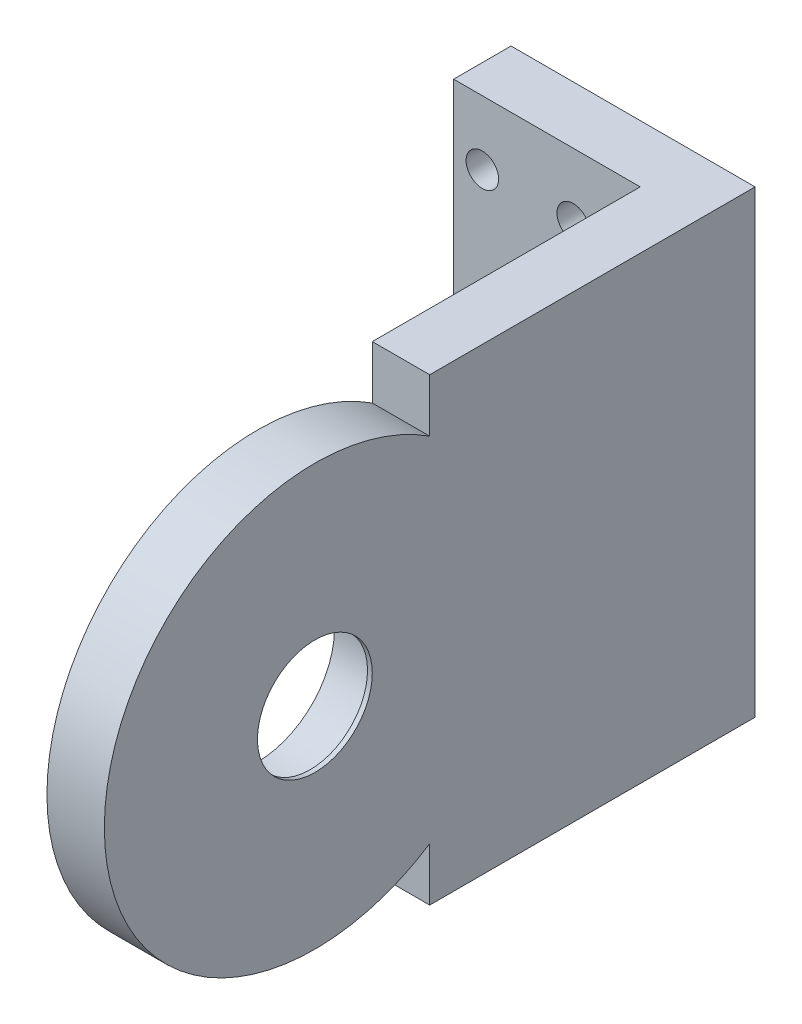
ISO-10303-21;
HEADER;
FILE_DESCRIPTION(('STEP AP214'),'2;1');
FILE_NAME('part.step','',(''),(''),'','','');
FILE_SCHEMA(('AUTOMOTIVE_DESIGN { 1 0 10303 214 1 1 1 1 }'));
ENDSEC;
DATA;
#1=APPLICATION_CONTEXT('core data for automotive mechanical design processes');
#2=APPLICATION_PROTOCOL_DEFINITION('international standard','automotive_design',2000,#1);
#3=PRODUCT_CONTEXT('',#1,'mechanical');
#4=PRODUCT('Part','Part','',(#3));
#5=PRODUCT_RELATED_PRODUCT_CATEGORY('part','',(#4));
#6=PRODUCT_DEFINITION_FORMATION('','',#4);
#7=PRODUCT_DEFINITION_CONTEXT('part definition',#1,'design');
#8=PRODUCT_DEFINITION('design','',#6,#7);
#9=PRODUCT_DEFINITION_SHAPE('','',#8);
#10=(LENGTH_UNIT() NAMED_UNIT(*) SI_UNIT(.MILLI.,.METRE.));
#11=(NAMED_UNIT(*) PLANE_ANGLE_UNIT() SI_UNIT($,.RADIAN.));
#12=(NAMED_UNIT(*) SI_UNIT($,.STERADIAN.) SOLID_ANGLE_UNIT());
#13=UNCERTAINTY_MEASURE_WITH_UNIT(LENGTH_MEASURE(1.E-05),#10,'distance_accuracy_value','');
#14=(GEOMETRIC_REPRESENTATION_CONTEXT(3) GLOBAL_UNCERTAINTY_ASSIGNED_CONTEXT((#13)) GLOBAL_UNIT_ASSIGNED_CONTEXT((#10,
#11,#12)) REPRESENTATION_CONTEXT('',''));
#15=CARTESIAN_POINT('',(0.,0.,0.));
#16=DIRECTION('',(0.,0.,1.));
#17=DIRECTION('',(1.,0.,0.));
#18=AXIS2_PLACEMENT_3D('',#15,#16,#17);
#19=CARTESIAN_POINT('',(342.5,300.,300.));
#20=DIRECTION('',(-1.,0.,0.));
#21=DIRECTION('',(0.,0.,1.));
#22=AXIS2_PLACEMENT_3D('',#19,#20,#21);
#23=CYLINDRICAL_SURFACE('',#22,22.);
#24=DIRECTION('',(-1.,0.,0.));
#25=VECTOR('',#24,1.);
#26=CARTESIAN_POINT('',(342.5,281.560911085414,288.));
#27=LINE('',#26,#25);
#28=CARTESIAN_POINT('',(342.5,281.560911085414,288.));
#29=VERTEX_POINT('',#28);
#30=CARTESIAN_POINT('',(336.5,281.560911085414,288.));
#31=VERTEX_POINT('',#30);
#32=EDGE_CURVE('E63',#29,#31,#27,.T.);
#33=ORIENTED_EDGE('',*,*,#32,.F.);
#34=CARTESIAN_POINT('',(342.5,300.,300.));
#35=DIRECTION('',(1.,0.,0.));
#36=DIRECTION('',(0.,0.,-1.));
#37=AXIS2_PLACEMENT_3D('',#34,#35,#36);
#38=CIRCLE('',#37,22.);
#39=CARTESIAN_POINT('',(342.5,318.439088914586,288.));
#40=VERTEX_POINT('',#39);
#41=EDGE_CURVE('E11',#40,#29,#38,.T.);
#42=ORIENTED_EDGE('',*,*,#41,.F.);
#43=DIRECTION('',(-1.,0.,0.));
#44=VECTOR('',#43,1.);
#45=CARTESIAN_POINT('',(342.5,318.439088914586,288.));
#46=LINE('',#45,#44);
#47=CARTESIAN_POINT('',(336.5,318.439088914586,288.));
#48=VERTEX_POINT('',#47);
#49=EDGE_CURVE('E169',#48,#40,#46,.F.);
#50=ORIENTED_EDGE('',*,*,#49,.F.);
#51=CARTESIAN_POINT('',(336.5,300.,300.));
#52=DIRECTION('',(1.,0.,0.));
#53=DIRECTION('',(0.,0.,-1.));
#54=AXIS2_PLACEMENT_3D('',#51,#52,#53);
#55=CIRCLE('',#54,22.);
#56=EDGE_CURVE('E47',#48,#31,#55,.T.);
#57=ORIENTED_EDGE('',*,*,#56,.T.);
#58=EDGE_LOOP('',(#33,#42,#50,#57));
#59=FACE_BOUND('',#58,.T.);
#60=ADVANCED_FACE('F39',(#59),#23,.T.);
#61=CARTESIAN_POINT('',(342.5,300.,300.));
#62=DIRECTION('',(1.,0.,0.));
#63=DIRECTION('',(0.,0.,-1.));
#64=AXIS2_PLACEMENT_3D('',#61,#62,#63);
#65=PLANE('',#64);
#66=CARTESIAN_POINT('',(342.5,300.,300.));
#67=DIRECTION('',(1.,0.,0.));
#68=DIRECTION('',(0.,0.,-1.));
#69=AXIS2_PLACEMENT_3D('',#66,#67,#68);
#70=CIRCLE('',#69,6.00000000000001);
#71=CARTESIAN_POINT('',(342.5,300.,294.));
#72=VERTEX_POINT('',#71);
#73=EDGE_CURVE('E139',#72,#72,#70,.F.);
#74=ORIENTED_EDGE('',*,*,#73,.T.);
#75=EDGE_LOOP('',(#74));
#76=FACE_BOUND('',#75,.T.);
#77=ORIENTED_EDGE('',*,*,#41,.T.);
#78=DIRECTION('',(0.,-1.,0.));
#79=VECTOR('',#78,1.);
#80=CARTESIAN_POINT('',(342.5,276.,288.));
#81=LINE('',#80,#79);
#82=CARTESIAN_POINT('',(342.5,276.,288.));
#83=VERTEX_POINT('',#82);
#84=EDGE_CURVE('E148',#29,#83,#81,.T.);
#85=ORIENTED_EDGE('',*,*,#84,.T.);
#86=DIRECTION('',(0.,0.,-1.));
#87=VECTOR('',#86,1.);
#88=CARTESIAN_POINT('',(342.5,276.,254.));
#89=LINE('',#88,#87);
#90=CARTESIAN_POINT('',(342.5,276.,254.));
#91=VERTEX_POINT('',#90);
#92=EDGE_CURVE('E152',#83,#91,#89,.T.);
#93=ORIENTED_EDGE('',*,*,#92,.T.);
#94=DIRECTION('',(0.,1.,0.));
#95=VECTOR('',#94,1.);
#96=CARTESIAN_POINT('',(342.5,324.,254.));
#97=LINE('',#96,#95);
#98=CARTESIAN_POINT('',(342.5,324.,254.));
#99=VERTEX_POINT('',#98);
#100=EDGE_CURVE('E143',#91,#99,#97,.T.);
#101=ORIENTED_EDGE('',*,*,#100,.T.);
#102=DIRECTION('',(0.,0.,1.));
#103=VECTOR('',#102,1.);
#104=CARTESIAN_POINT('',(342.5,324.,288.));
#105=LINE('',#104,#103);
#106=CARTESIAN_POINT('',(342.5,324.,288.));
#107=VERTEX_POINT('',#106);
#108=EDGE_CURVE('E146',#99,#107,#105,.T.);
#109=ORIENTED_EDGE('',*,*,#108,.T.);
#110=EDGE_CURVE('E149',#107,#40,#81,.T.);
#111=ORIENTED_EDGE('',*,*,#110,.T.);
#112=EDGE_LOOP('',(#77,#85,#93,#101,#109,#111));
#113=FACE_BOUND('',#112,.T.);
#114=ADVANCED_FACE('F188',(#76,#113),#65,.T.);
#115=CARTESIAN_POINT('',(336.5,300.,300.));
#116=DIRECTION('',(1.,0.,0.));
#117=DIRECTION('',(0.,0.,-1.));
#118=AXIS2_PLACEMENT_3D('',#115,#116,#117);
#119=PLANE('',#118);
#120=CARTESIAN_POINT('',(336.5,300.,300.));
#121=DIRECTION('',(1.,0.,0.));
#122=DIRECTION('',(0.,0.,-1.));
#123=AXIS2_PLACEMENT_3D('',#120,#121,#122);
#124=CIRCLE('',#123,8.05);
#125=CARTESIAN_POINT('',(336.5,300.,291.95));
#126=VERTEX_POINT('',#125);
#127=EDGE_CURVE('E129',#126,#126,#124,.T.);
#128=ORIENTED_EDGE('',*,*,#127,.T.);
#129=EDGE_LOOP('',(#128));
#130=FACE_BOUND('',#129,.T.);
#131=DIRECTION('',(0.,0.,1.));
#132=VECTOR('',#131,1.);
#133=CARTESIAN_POINT('',(336.5,324.,288.));
#134=LINE('',#133,#132);
#135=CARTESIAN_POINT('',(336.5,324.,260.));
#136=VERTEX_POINT('',#135);
#137=CARTESIAN_POINT('',(336.5,324.,288.));
#138=VERTEX_POINT('',#137);
#139=EDGE_CURVE('E142',#136,#138,#134,.T.);
#140=ORIENTED_EDGE('',*,*,#139,.F.);
#141=DIRECTION('',(0.,-1.,0.));
#142=VECTOR('',#141,1.);
#143=CARTESIAN_POINT('',(336.5,300.,260.));
#144=LINE('',#143,#142);
#145=CARTESIAN_POINT('',(336.5,276.,260.));
#146=VERTEX_POINT('',#145);
#147=EDGE_CURVE('E126',#136,#146,#144,.T.);
#148=ORIENTED_EDGE('',*,*,#147,.T.);
#149=DIRECTION('',(0.,0.,-1.));
#150=VECTOR('',#149,1.);
#151=CARTESIAN_POINT('',(336.5,276.,254.));
#152=LINE('',#151,#150);
#153=CARTESIAN_POINT('',(336.5,276.,288.));
#154=VERTEX_POINT('',#153);
#155=EDGE_CURVE('E113',#154,#146,#152,.T.);
#156=ORIENTED_EDGE('',*,*,#155,.F.);
#157=DIRECTION('',(0.,-1.,0.));
#158=VECTOR('',#157,1.);
#159=CARTESIAN_POINT('',(336.5,276.,288.));
#160=LINE('',#159,#158);
#161=EDGE_CURVE('E156',#31,#154,#160,.T.);
#162=ORIENTED_EDGE('',*,*,#161,.F.);
#163=ORIENTED_EDGE('',*,*,#56,.F.);
#164=EDGE_CURVE('E157',#138,#48,#160,.T.);
#165=ORIENTED_EDGE('',*,*,#164,.F.);
#166=EDGE_LOOP('',(#140,#148,#156,#162,#163,#165));
#167=FACE_BOUND('',#166,.T.);
#168=ADVANCED_FACE('F181',(#130,#167),#119,.F.);
#169=CARTESIAN_POINT('',(342.5,276.,288.));
#170=DIRECTION('',(0.,0.,-1.));
#171=DIRECTION('',(-1.,0.,0.));
#172=AXIS2_PLACEMENT_3D('',#169,#170,#171);
#173=PLANE('',#172);
#174=ORIENTED_EDGE('',*,*,#84,.F.);
#175=ORIENTED_EDGE('',*,*,#32,.T.);
#176=ORIENTED_EDGE('',*,*,#161,.T.);
#177=DIRECTION('',(-1.,0.,0.));
#178=VECTOR('',#177,1.);
#179=CARTESIAN_POINT('',(342.5,276.,288.));
#180=LINE('',#179,#178);
#181=EDGE_CURVE('E162',#83,#154,#180,.T.);
#182=ORIENTED_EDGE('',*,*,#181,.F.);
#183=EDGE_LOOP('',(#174,#175,#176,#182));
#184=FACE_BOUND('',#183,.T.);
#185=ADVANCED_FACE('F178',(#184),#173,.F.);
#186=ORIENTED_EDGE('',*,*,#164,.T.);
#187=ORIENTED_EDGE('',*,*,#49,.T.);
#188=ORIENTED_EDGE('',*,*,#110,.F.);
#189=DIRECTION('',(-1.,0.,0.));
#190=VECTOR('',#189,1.);
#191=CARTESIAN_POINT('',(342.5,324.,288.));
#192=LINE('',#191,#190);
#193=EDGE_CURVE('E164',#107,#138,#192,.T.);
#194=ORIENTED_EDGE('',*,*,#193,.T.);
#195=EDGE_LOOP('',(#186,#187,#188,#194));
#196=FACE_BOUND('',#195,.T.);
#197=ADVANCED_FACE('F186',(#196),#173,.F.);
#198=CARTESIAN_POINT('',(342.5,324.,254.));
#199=DIRECTION('',(0.,0.,1.));
#200=DIRECTION('',(1.,0.,0.));
#201=AXIS2_PLACEMENT_3D('',#198,#199,#200);
#202=PLANE('',#201);
#203=DIRECTION('',(0.,-1.,0.));
#204=VECTOR('',#203,1.);
#205=CARTESIAN_POINT('',(317.,324.,254.));
#206=LINE('',#205,#204);
#207=CARTESIAN_POINT('',(317.,324.,254.));
#208=VERTEX_POINT('',#207);
#209=CARTESIAN_POINT('',(317.,276.,254.));
#210=VERTEX_POINT('',#209);
#211=EDGE_CURVE('E122',#208,#210,#206,.T.);
#212=ORIENTED_EDGE('',*,*,#211,.F.);
#213=DIRECTION('',(-1.,0.,0.));
#214=VECTOR('',#213,1.);
#215=CARTESIAN_POINT('',(342.5,324.,254.));
#216=LINE('',#215,#214);
#217=EDGE_CURVE('E167',#99,#208,#216,.T.);
#218=ORIENTED_EDGE('',*,*,#217,.F.);
#219=ORIENTED_EDGE('',*,*,#100,.F.);
#220=DIRECTION('',(-1.,0.,0.));
#221=VECTOR('',#220,1.);
#222=CARTESIAN_POINT('',(342.5,276.,254.));
#223=LINE('',#222,#221);
#224=EDGE_CURVE('E154',#91,#210,#223,.T.);
#225=ORIENTED_EDGE('',*,*,#224,.T.);
#226=EDGE_LOOP('',(#212,#218,#219,#225));
#227=FACE_BOUND('',#226,.T.);
#228=CARTESIAN_POINT('',(320.,282.7,254.));
#229=DIRECTION('',(0.,0.,1.));
#230=DIRECTION('',(1.,0.,0.));
#231=AXIS2_PLACEMENT_3D('',#228,#229,#230);
#232=CIRCLE('',#231,1.69999999999998);
#233=CARTESIAN_POINT('',(321.7,282.7,254.));
#234=VERTEX_POINT('',#233);
#235=EDGE_CURVE('E196',#234,#234,#232,.T.);
#236=ORIENTED_EDGE('',*,*,#235,.T.);
#237=EDGE_LOOP('',(#236));
#238=FACE_BOUND('',#237,.T.);
#239=CARTESIAN_POINT('',(320.,317.3,254.));
#240=DIRECTION('',(0.,0.,1.));
#241=DIRECTION('',(1.,0.,0.));
#242=AXIS2_PLACEMENT_3D('',#239,#240,#241);
#243=CIRCLE('',#242,1.69999999999998);
#244=CARTESIAN_POINT('',(321.7,317.3,254.));
#245=VERTEX_POINT('',#244);
#246=EDGE_CURVE('E203',#245,#245,#243,.T.);
#247=ORIENTED_EDGE('',*,*,#246,.T.);
#248=EDGE_LOOP('',(#247));
#249=FACE_BOUND('',#248,.T.);
#250=CARTESIAN_POINT('',(329.5,282.7,254.));
#251=DIRECTION('',(0.,0.,1.));
#252=DIRECTION('',(1.,0.,0.));
#253=AXIS2_PLACEMENT_3D('',#250,#251,#252);
#254=CIRCLE('',#253,1.69999999999998);
#255=CARTESIAN_POINT('',(331.2,282.7,254.));
#256=VERTEX_POINT('',#255);
#257=EDGE_CURVE('E209',#256,#256,#254,.T.);
#258=ORIENTED_EDGE('',*,*,#257,.T.);
#259=EDGE_LOOP('',(#258));
#260=FACE_BOUND('',#259,.T.);
#261=CARTESIAN_POINT('',(329.5,317.3,254.));
#262=DIRECTION('',(0.,0.,1.));
#263=DIRECTION('',(1.,0.,0.));
#264=AXIS2_PLACEMENT_3D('',#261,#262,#263);
#265=CIRCLE('',#264,1.69999999999998);
#266=CARTESIAN_POINT('',(331.2,317.3,254.));
#267=VERTEX_POINT('',#266);
#268=EDGE_CURVE('E215',#267,#267,#265,.T.);
#269=ORIENTED_EDGE('',*,*,#268,.T.);
#270=EDGE_LOOP('',(#269));
#271=FACE_BOUND('',#270,.T.);
#272=ADVANCED_FACE('F192',(#227,#238,#249,#260,#271),#202,.F.);
#273=CARTESIAN_POINT('',(342.5,324.,288.));
#274=DIRECTION('',(0.,-1.,0.));
#275=DIRECTION('',(0.,0.,-1.));
#276=AXIS2_PLACEMENT_3D('',#273,#274,#275);
#277=PLANE('',#276);
#278=ORIENTED_EDGE('',*,*,#217,.T.);
#279=DIRECTION('',(0.,0.,-1.));
#280=VECTOR('',#279,1.);
#281=CARTESIAN_POINT('',(317.,324.,260.));
#282=LINE('',#281,#280);
#283=CARTESIAN_POINT('',(317.,324.,260.));
#284=VERTEX_POINT('',#283);
#285=EDGE_CURVE('E127',#284,#208,#282,.T.);
#286=ORIENTED_EDGE('',*,*,#285,.F.);
#287=DIRECTION('',(-1.,0.,0.));
#288=VECTOR('',#287,1.);
#289=CARTESIAN_POINT('',(336.51,324.,260.));
#290=LINE('',#289,#288);
#291=EDGE_CURVE('E55',#136,#284,#290,.T.);
#292=ORIENTED_EDGE('',*,*,#291,.F.);
#293=ORIENTED_EDGE('',*,*,#139,.T.);
#294=ORIENTED_EDGE('',*,*,#193,.F.);
#295=ORIENTED_EDGE('',*,*,#108,.F.);
#296=EDGE_LOOP('',(#278,#286,#292,#293,#294,#295));
#297=FACE_BOUND('',#296,.T.);
#298=ADVANCED_FACE('F183',(#297),#277,.F.);
#299=CARTESIAN_POINT('',(342.5,276.,254.));
#300=DIRECTION('',(0.,1.,0.));
#301=DIRECTION('',(0.,0.,1.));
#302=AXIS2_PLACEMENT_3D('',#299,#300,#301);
#303=PLANE('',#302);
#304=ORIENTED_EDGE('',*,*,#155,.T.);
#305=DIRECTION('',(1.,0.,0.));
#306=VECTOR('',#305,1.);
#307=CARTESIAN_POINT('',(317.,276.,260.));
#308=LINE('',#307,#306);
#309=CARTESIAN_POINT('',(317.,276.,260.));
#310=VERTEX_POINT('',#309);
#311=EDGE_CURVE('E104',#310,#146,#308,.T.);
#312=ORIENTED_EDGE('',*,*,#311,.F.);
#313=DIRECTION('',(0.,0.,-1.));
#314=VECTOR('',#313,1.);
#315=CARTESIAN_POINT('',(317.,276.,260.));
#316=LINE('',#315,#314);
#317=EDGE_CURVE('E109',#310,#210,#316,.T.);
#318=ORIENTED_EDGE('',*,*,#317,.T.);
#319=ORIENTED_EDGE('',*,*,#224,.F.);
#320=ORIENTED_EDGE('',*,*,#92,.F.);
#321=ORIENTED_EDGE('',*,*,#181,.T.);
#322=EDGE_LOOP('',(#304,#312,#318,#319,#320,#321));
#323=FACE_BOUND('',#322,.T.);
#324=ADVANCED_FACE('F106',(#323),#303,.F.);
#325=CARTESIAN_POINT('',(342.51,300.,300.));
#326=DIRECTION('',(-1.,0.,0.));
#327=DIRECTION('',(0.,0.,1.));
#328=AXIS2_PLACEMENT_3D('',#325,#326,#327);
#329=CYLINDRICAL_SURFACE('',#328,6.00000000000001);
#330=CARTESIAN_POINT('',(342.,300.,300.));
#331=DIRECTION('',(1.,0.,0.));
#332=DIRECTION('',(0.,0.,-1.));
#333=AXIS2_PLACEMENT_3D('',#330,#331,#332);
#334=CIRCLE('',#333,6.00000000000001);
#335=CARTESIAN_POINT('',(342.,300.,294.));
#336=VERTEX_POINT('',#335);
#337=EDGE_CURVE('E42',#336,#336,#334,.T.);
#338=ORIENTED_EDGE('',*,*,#337,.F.);
#339=EDGE_LOOP('',(#338));
#340=FACE_BOUND('',#339,.T.);
#341=ORIENTED_EDGE('',*,*,#73,.F.);
#342=EDGE_LOOP('',(#341));
#343=FACE_BOUND('',#342,.T.);
#344=ADVANCED_FACE('F268',(#340,#343),#329,.F.);
#345=CARTESIAN_POINT('',(342.,300.,300.));
#346=DIRECTION('',(-1.,0.,0.));
#347=DIRECTION('',(0.,0.,1.));
#348=AXIS2_PLACEMENT_3D('',#345,#346,#347);
#349=CYLINDRICAL_SURFACE('',#348,8.05);
#350=CARTESIAN_POINT('',(342.,300.,300.));
#351=DIRECTION('',(1.,0.,0.));
#352=DIRECTION('',(0.,0.,-1.));
#353=AXIS2_PLACEMENT_3D('',#350,#351,#352);
#354=CIRCLE('',#353,8.05);
#355=CARTESIAN_POINT('',(342.,300.,291.95));
#356=VERTEX_POINT('',#355);
#357=EDGE_CURVE('E134',#356,#356,#354,.T.);
#358=ORIENTED_EDGE('',*,*,#357,.T.);
#359=EDGE_LOOP('',(#358));
#360=FACE_BOUND('',#359,.T.);
#361=ORIENTED_EDGE('',*,*,#127,.F.);
#362=EDGE_LOOP('',(#361));
#363=FACE_BOUND('',#362,.T.);
#364=ADVANCED_FACE('F270',(#360,#363),#349,.F.);
#365=CARTESIAN_POINT('',(342.,300.,300.));
#366=DIRECTION('',(1.,0.,0.));
#367=DIRECTION('',(0.,0.,-1.));
#368=AXIS2_PLACEMENT_3D('',#365,#366,#367);
#369=PLANE('',#368);
#370=ORIENTED_EDGE('',*,*,#337,.T.);
#371=EDGE_LOOP('',(#370));
#372=FACE_BOUND('',#371,.T.);
#373=ORIENTED_EDGE('',*,*,#357,.F.);
#374=EDGE_LOOP('',(#373));
#375=FACE_BOUND('',#374,.T.);
#376=ADVANCED_FACE('F226',(#372,#375),#369,.F.);
#377=CARTESIAN_POINT('',(0.,0.,260.));
#378=DIRECTION('',(0.,0.,1.));
#379=DIRECTION('',(1.,0.,0.));
#380=AXIS2_PLACEMENT_3D('',#377,#378,#379);
#381=PLANE('',#380);
#382=CARTESIAN_POINT('',(329.5,317.3,260.));
#383=DIRECTION('',(0.,0.,1.));
#384=DIRECTION('',(1.,0.,0.));
#385=AXIS2_PLACEMENT_3D('',#382,#383,#384);
#386=CIRCLE('',#385,1.69999999999998);
#387=CARTESIAN_POINT('',(331.2,317.3,260.));
#388=VERTEX_POINT('',#387);
#389=EDGE_CURVE('E212',#388,#388,#386,.T.);
#390=ORIENTED_EDGE('',*,*,#389,.F.);
#391=EDGE_LOOP('',(#390));
#392=FACE_BOUND('',#391,.T.);
#393=CARTESIAN_POINT('',(320.,317.3,260.));
#394=DIRECTION('',(0.,0.,1.));
#395=DIRECTION('',(1.,0.,0.));
#396=AXIS2_PLACEMENT_3D('',#393,#394,#395);
#397=CIRCLE('',#396,1.69999999999998);
#398=CARTESIAN_POINT('',(321.7,317.3,260.));
#399=VERTEX_POINT('',#398);
#400=EDGE_CURVE('E201',#399,#399,#397,.T.);
#401=ORIENTED_EDGE('',*,*,#400,.F.);
#402=EDGE_LOOP('',(#401));
#403=FACE_BOUND('',#402,.T.);
#404=CARTESIAN_POINT('',(320.,282.7,260.));
#405=DIRECTION('',(0.,0.,1.));
#406=DIRECTION('',(1.,0.,0.));
#407=AXIS2_PLACEMENT_3D('',#404,#405,#406);
#408=CIRCLE('',#407,1.69999999999998);
#409=CARTESIAN_POINT('',(321.7,282.7,260.));
#410=VERTEX_POINT('',#409);
#411=EDGE_CURVE('E194',#410,#410,#408,.T.);
#412=ORIENTED_EDGE('',*,*,#411,.F.);
#413=EDGE_LOOP('',(#412));
#414=FACE_BOUND('',#413,.T.);
#415=CARTESIAN_POINT('',(329.5,282.7,260.));
#416=DIRECTION('',(0.,0.,1.));
#417=DIRECTION('',(1.,0.,0.));
#418=AXIS2_PLACEMENT_3D('',#415,#416,#417);
#419=CIRCLE('',#418,1.69999999999998);
#420=CARTESIAN_POINT('',(331.2,282.7,260.));
#421=VERTEX_POINT('',#420);
#422=EDGE_CURVE('E206',#421,#421,#419,.T.);
#423=ORIENTED_EDGE('',*,*,#422,.F.);
#424=EDGE_LOOP('',(#423));
#425=FACE_BOUND('',#424,.T.);
#426=ORIENTED_EDGE('',*,*,#147,.F.);
#427=ORIENTED_EDGE('',*,*,#291,.T.);
#428=DIRECTION('',(0.,-1.,0.));
#429=VECTOR('',#428,1.);
#430=CARTESIAN_POINT('',(317.,324.,260.));
#431=LINE('',#430,#429);
#432=EDGE_CURVE('E116',#284,#310,#431,.T.);
#433=ORIENTED_EDGE('',*,*,#432,.T.);
#434=ORIENTED_EDGE('',*,*,#311,.T.);
#435=EDGE_LOOP('',(#426,#427,#433,#434));
#436=FACE_BOUND('',#435,.T.);
#437=ADVANCED_FACE('F119',(#392,#403,#414,#425,#436),#381,.T.);
#438=CARTESIAN_POINT('',(317.,324.,260.));
#439=DIRECTION('',(1.,0.,0.));
#440=DIRECTION('',(0.,0.,-1.));
#441=AXIS2_PLACEMENT_3D('',#438,#439,#440);
#442=PLANE('',#441);
#443=ORIENTED_EDGE('',*,*,#211,.T.);
#444=ORIENTED_EDGE('',*,*,#317,.F.);
#445=ORIENTED_EDGE('',*,*,#432,.F.);
#446=ORIENTED_EDGE('',*,*,#285,.T.);
#447=EDGE_LOOP('',(#443,#444,#445,#446));
#448=FACE_BOUND('',#447,.T.);
#449=ADVANCED_FACE('F124',(#448),#442,.F.);
#450=CARTESIAN_POINT('',(320.,282.7,260.));
#451=DIRECTION('',(0.,0.,-1.));
#452=DIRECTION('',(-1.,0.,0.));
#453=AXIS2_PLACEMENT_3D('',#450,#451,#452);
#454=CYLINDRICAL_SURFACE('',#453,1.69999999999998);
#455=ORIENTED_EDGE('',*,*,#411,.T.);
#456=EDGE_LOOP('',(#455));
#457=FACE_BOUND('',#456,.T.);
#458=ORIENTED_EDGE('',*,*,#235,.F.);
#459=EDGE_LOOP('',(#458));
#460=FACE_BOUND('',#459,.T.);
#461=ADVANCED_FACE('F279',(#457,#460),#454,.F.);
#462=CARTESIAN_POINT('',(320.,317.3,260.));
#463=DIRECTION('',(0.,0.,-1.));
#464=DIRECTION('',(-1.,0.,0.));
#465=AXIS2_PLACEMENT_3D('',#462,#463,#464);
#466=CYLINDRICAL_SURFACE('',#465,1.69999999999998);
#467=ORIENTED_EDGE('',*,*,#400,.T.);
#468=EDGE_LOOP('',(#467));
#469=FACE_BOUND('',#468,.T.);
#470=ORIENTED_EDGE('',*,*,#246,.F.);
#471=EDGE_LOOP('',(#470));
#472=FACE_BOUND('',#471,.T.);
#473=ADVANCED_FACE('F237',(#469,#472),#466,.F.);
#474=CARTESIAN_POINT('',(329.5,282.7,260.));
#475=DIRECTION('',(0.,0.,-1.));
#476=DIRECTION('',(-1.,0.,0.));
#477=AXIS2_PLACEMENT_3D('',#474,#475,#476);
#478=CYLINDRICAL_SURFACE('',#477,1.69999999999998);
#479=ORIENTED_EDGE('',*,*,#422,.T.);
#480=EDGE_LOOP('',(#479));
#481=FACE_BOUND('',#480,.T.);
#482=ORIENTED_EDGE('',*,*,#257,.F.);
#483=EDGE_LOOP('',(#482));
#484=FACE_BOUND('',#483,.T.);
#485=ADVANCED_FACE('F234',(#481,#484),#478,.F.);
#486=CARTESIAN_POINT('',(329.5,317.3,260.));
#487=DIRECTION('',(0.,0.,-1.));
#488=DIRECTION('',(-1.,0.,0.));
#489=AXIS2_PLACEMENT_3D('',#486,#487,#488);
#490=CYLINDRICAL_SURFACE('',#489,1.69999999999998);
#491=ORIENTED_EDGE('',*,*,#389,.T.);
#492=EDGE_LOOP('',(#491));
#493=FACE_BOUND('',#492,.T.);
#494=ORIENTED_EDGE('',*,*,#268,.F.);
#495=EDGE_LOOP('',(#494));
#496=FACE_BOUND('',#495,.T.);
#497=ADVANCED_FACE('F221',(#493,#496),#490,.F.);
#498=CLOSED_SHELL('',(#60,#114,#168,#185,#197,#272,#298,#324,#344,#364,#376,#437,#449,#461,#473,
#485,#497));
#499=MANIFOLD_SOLID_BREP('B2',#498);
#500=ADVANCED_BREP_SHAPE_REPRESENTATION('',(#18,#499),#14);
#501=SHAPE_DEFINITION_REPRESENTATION(#9,#500);
ENDSEC;
END-ISO-10303-21;
